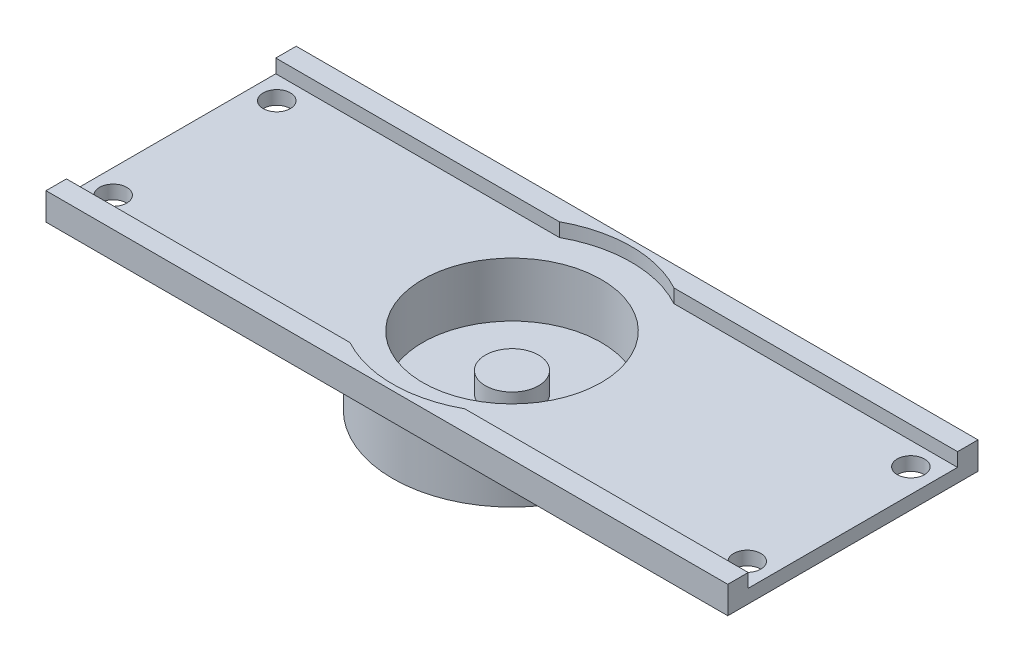
ISO-10303-21;
HEADER;
FILE_DESCRIPTION(('STEP AP214'),'2;1');
FILE_NAME('part.step','',(''),(''),'','','');
FILE_SCHEMA(('AUTOMOTIVE_DESIGN { 1 0 10303 214 1 1 1 1 }'));
ENDSEC;
DATA;
#1=APPLICATION_CONTEXT('core data for automotive mechanical design processes');
#2=APPLICATION_PROTOCOL_DEFINITION('international standard','automotive_design',2000,#1);
#3=PRODUCT_CONTEXT('',#1,'mechanical');
#4=PRODUCT('Part','Part','',(#3));
#5=PRODUCT_RELATED_PRODUCT_CATEGORY('part','',(#4));
#6=PRODUCT_DEFINITION_FORMATION('','',#4);
#7=PRODUCT_DEFINITION_CONTEXT('part definition',#1,'design');
#8=PRODUCT_DEFINITION('design','',#6,#7);
#9=PRODUCT_DEFINITION_SHAPE('','',#8);
#10=(LENGTH_UNIT() NAMED_UNIT(*) SI_UNIT(.MILLI.,.METRE.));
#11=(NAMED_UNIT(*) PLANE_ANGLE_UNIT() SI_UNIT($,.RADIAN.));
#12=(NAMED_UNIT(*) SI_UNIT($,.STERADIAN.) SOLID_ANGLE_UNIT());
#13=UNCERTAINTY_MEASURE_WITH_UNIT(LENGTH_MEASURE(1.E-05),#10,'distance_accuracy_value','');
#14=(GEOMETRIC_REPRESENTATION_CONTEXT(3) GLOBAL_UNCERTAINTY_ASSIGNED_CONTEXT((#13)) GLOBAL_UNIT_ASSIGNED_CONTEXT((#10,
#11,#12)) REPRESENTATION_CONTEXT('',''));
#15=CARTESIAN_POINT('',(0.,0.,0.));
#16=DIRECTION('',(0.,0.,1.));
#17=DIRECTION('',(1.,0.,0.));
#18=AXIS2_PLACEMENT_3D('',#15,#16,#17);
#19=CARTESIAN_POINT('',(0.,-36.,-36.7));
#20=DIRECTION('',(0.,-1.,0.));
#21=DIRECTION('',(0.,0.,-1.));
#22=AXIS2_PLACEMENT_3D('',#19,#20,#21);
#23=PLANE('',#22);
#24=CARTESIAN_POINT('',(46.5,-36.,-48.7));
#25=DIRECTION('',(0.,1.,0.));
#26=DIRECTION('',(0.,0.,1.));
#27=AXIS2_PLACEMENT_3D('',#24,#25,#26);
#28=CIRCLE('',#27,2.);
#29=CARTESIAN_POINT('',(46.5,-36.,-46.7));
#30=VERTEX_POINT('',#29);
#31=EDGE_CURVE('E490',#30,#30,#28,.T.);
#32=ORIENTED_EDGE('',*,*,#31,.T.);
#33=EDGE_LOOP('',(#32));
#34=FACE_BOUND('',#33,.T.);
#35=CARTESIAN_POINT('',(-46.5,-36.,-24.7));
#36=DIRECTION('',(0.,1.,0.));
#37=DIRECTION('',(0.,0.,1.));
#38=AXIS2_PLACEMENT_3D('',#35,#36,#37);
#39=CIRCLE('',#38,2.);
#40=CARTESIAN_POINT('',(-46.5,-36.,-22.7));
#41=VERTEX_POINT('',#40);
#42=EDGE_CURVE('E517',#41,#41,#39,.T.);
#43=ORIENTED_EDGE('',*,*,#42,.T.);
#44=EDGE_LOOP('',(#43));
#45=FACE_BOUND('',#44,.T.);
#46=CARTESIAN_POINT('',(-46.5,-36.,-48.7));
#47=DIRECTION('',(0.,1.,0.));
#48=DIRECTION('',(0.,0.,1.));
#49=AXIS2_PLACEMENT_3D('',#46,#47,#48);
#50=CIRCLE('',#49,2.);
#51=CARTESIAN_POINT('',(-46.5,-36.,-46.7));
#52=VERTEX_POINT('',#51);
#53=EDGE_CURVE('E512',#52,#52,#50,.T.);
#54=ORIENTED_EDGE('',*,*,#53,.T.);
#55=EDGE_LOOP('',(#54));
#56=FACE_BOUND('',#55,.T.);
#57=CARTESIAN_POINT('',(46.5,-36.,-24.7));
#58=DIRECTION('',(0.,1.,0.));
#59=DIRECTION('',(0.,0.,1.));
#60=AXIS2_PLACEMENT_3D('',#57,#58,#59);
#61=CIRCLE('',#60,2.);
#62=CARTESIAN_POINT('',(46.5,-36.,-22.7));
#63=VERTEX_POINT('',#62);
#64=EDGE_CURVE('E489',#63,#63,#61,.T.);
#65=ORIENTED_EDGE('',*,*,#64,.T.);
#66=EDGE_LOOP('',(#65));
#67=FACE_BOUND('',#66,.T.);
#68=DIRECTION('',(0.,0.,1.));
#69=VECTOR('',#68,1.);
#70=CARTESIAN_POINT('',(50.,-36.,-64.05));
#71=LINE('',#70,#69);
#72=CARTESIAN_POINT('',(50.,-36.,-55.05));
#73=VERTEX_POINT('',#72);
#74=CARTESIAN_POINT('',(50.,-36.,-18.35));
#75=VERTEX_POINT('',#74);
#76=EDGE_CURVE('E330',#73,#75,#71,.T.);
#77=ORIENTED_EDGE('',*,*,#76,.T.);
#78=DIRECTION('',(-1.,0.,0.));
#79=VECTOR('',#78,1.);
#80=CARTESIAN_POINT('',(50.,-36.,-18.35));
#81=LINE('',#80,#79);
#82=CARTESIAN_POINT('',(-50.,-36.,-18.35));
#83=VERTEX_POINT('',#82);
#84=EDGE_CURVE('E334',#75,#83,#81,.T.);
#85=ORIENTED_EDGE('',*,*,#84,.T.);
#86=DIRECTION('',(0.,0.,-1.));
#87=VECTOR('',#86,1.);
#88=CARTESIAN_POINT('',(-50.,-36.,-9.35));
#89=LINE('',#88,#87);
#90=CARTESIAN_POINT('',(-50.,-36.,-55.05));
#91=VERTEX_POINT('',#90);
#92=EDGE_CURVE('E343',#83,#91,#89,.T.);
#93=ORIENTED_EDGE('',*,*,#92,.T.);
#94=DIRECTION('',(1.,0.,0.));
#95=VECTOR('',#94,1.);
#96=CARTESIAN_POINT('',(50.,-36.,-55.05));
#97=LINE('',#96,#95);
#98=EDGE_CURVE('E347',#91,#73,#97,.T.);
#99=ORIENTED_EDGE('',*,*,#98,.T.);
#100=EDGE_LOOP('',(#77,#85,#93,#99));
#101=FACE_BOUND('',#100,.T.);
#102=DIRECTION('',(-1.,0.,0.));
#103=VECTOR('',#102,1.);
#104=CARTESIAN_POINT('',(0.,-36.,-31.7));
#105=LINE('',#104,#103);
#106=CARTESIAN_POINT('',(39.,-36.,-31.7));
#107=VERTEX_POINT('',#106);
#108=CARTESIAN_POINT('',(16.7705098312484,-36.,-31.7));
#109=VERTEX_POINT('',#108);
#110=EDGE_CURVE('E461',#107,#109,#105,.T.);
#111=ORIENTED_EDGE('',*,*,#110,.F.);
#112=DIRECTION('',(0.,0.,1.));
#113=VECTOR('',#112,1.);
#114=CARTESIAN_POINT('',(39.,-36.,-36.7));
#115=LINE('',#114,#113);
#116=CARTESIAN_POINT('',(39.,-36.,-41.7));
#117=VERTEX_POINT('',#116);
#118=EDGE_CURVE('E411',#107,#117,#115,.F.);
#119=ORIENTED_EDGE('',*,*,#118,.T.);
#120=DIRECTION('',(-1.,0.,0.));
#121=VECTOR('',#120,1.);
#122=CARTESIAN_POINT('',(0.,-36.,-41.7));
#123=LINE('',#122,#121);
#124=CARTESIAN_POINT('',(16.7705098312484,-36.,-41.7));
#125=VERTEX_POINT('',#124);
#126=EDGE_CURVE('E457',#117,#125,#123,.T.);
#127=ORIENTED_EDGE('',*,*,#126,.T.);
#128=CARTESIAN_POINT('',(0.,-36.,-36.7));
#129=DIRECTION('',(0.,1.,0.));
#130=DIRECTION('',(1.,0.,0.));
#131=AXIS2_PLACEMENT_3D('',#128,#129,#130);
#132=CIRCLE('',#131,17.5);
#133=CARTESIAN_POINT('',(-16.7705098312484,-36.,-41.7));
#134=VERTEX_POINT('',#133);
#135=EDGE_CURVE('E263',#125,#134,#132,.T.);
#136=ORIENTED_EDGE('',*,*,#135,.T.);
#137=DIRECTION('',(-1.,0.,0.));
#138=VECTOR('',#137,1.);
#139=CARTESIAN_POINT('',(0.,-36.,-41.7));
#140=LINE('',#139,#138);
#141=CARTESIAN_POINT('',(-39.,-36.,-41.7));
#142=VERTEX_POINT('',#141);
#143=EDGE_CURVE('E468',#134,#142,#140,.T.);
#144=ORIENTED_EDGE('',*,*,#143,.T.);
#145=DIRECTION('',(0.,0.,1.));
#146=VECTOR('',#145,1.);
#147=CARTESIAN_POINT('',(-39.,-36.,-31.7));
#148=LINE('',#147,#146);
#149=CARTESIAN_POINT('',(-39.,-36.,-31.7));
#150=VERTEX_POINT('',#149);
#151=EDGE_CURVE('E396',#142,#150,#148,.T.);
#152=ORIENTED_EDGE('',*,*,#151,.T.);
#153=DIRECTION('',(-1.,0.,0.));
#154=VECTOR('',#153,1.);
#155=CARTESIAN_POINT('',(0.,-36.,-31.7));
#156=LINE('',#155,#154);
#157=CARTESIAN_POINT('',(-16.7705098312484,-36.,-31.7));
#158=VERTEX_POINT('',#157);
#159=EDGE_CURVE('E250',#158,#150,#156,.T.);
#160=ORIENTED_EDGE('',*,*,#159,.F.);
#161=EDGE_CURVE('E248',#158,#109,#132,.T.);
#162=ORIENTED_EDGE('',*,*,#161,.T.);
#163=EDGE_LOOP('',(#111,#119,#127,#136,#144,#152,#160,#162));
#164=FACE_BOUND('',#163,.T.);
#165=ADVANCED_FACE('F55',(#34,#45,#56,#67,#101,#164),#23,.T.);
#166=CARTESIAN_POINT('',(0.,-34.,-36.7));
#167=DIRECTION('',(0.,-1.,0.));
#168=DIRECTION('',(1.,0.,0.));
#169=AXIS2_PLACEMENT_3D('',#166,#167,#168);
#170=CYLINDRICAL_SURFACE('',#169,17.5);
#171=ORIENTED_EDGE('',*,*,#161,.F.);
#172=DIRECTION('',(0.,-1.,0.));
#173=VECTOR('',#172,1.);
#174=CARTESIAN_POINT('',(-16.7705098312484,-15.2078305169323,-31.7));
#175=LINE('',#174,#173);
#176=CARTESIAN_POINT('',(-16.7705098312484,-44.,-31.7));
#177=VERTEX_POINT('',#176);
#178=EDGE_CURVE('E232',#158,#177,#175,.T.);
#179=ORIENTED_EDGE('',*,*,#178,.T.);
#180=CARTESIAN_POINT('',(0.,-44.,-36.7));
#181=DIRECTION('',(0.,-1.,0.));
#182=DIRECTION('',(1.,0.,0.));
#183=AXIS2_PLACEMENT_3D('',#180,#181,#182);
#184=CIRCLE('',#183,17.5);
#185=CARTESIAN_POINT('',(16.7705098312484,-44.,-31.7));
#186=VERTEX_POINT('',#185);
#187=EDGE_CURVE('E245',#186,#177,#184,.T.);
#188=ORIENTED_EDGE('',*,*,#187,.F.);
#189=DIRECTION('',(0.,-1.,0.));
#190=VECTOR('',#189,1.);
#191=CARTESIAN_POINT('',(16.7705098312484,-15.2078305169323,-31.7));
#192=LINE('',#191,#190);
#193=EDGE_CURVE('E477',#109,#186,#192,.T.);
#194=ORIENTED_EDGE('',*,*,#193,.F.);
#195=EDGE_LOOP('',(#171,#179,#188,#194));
#196=FACE_BOUND('',#195,.T.);
#197=ADVANCED_FACE('F244',(#196),#170,.T.);
#198=DIRECTION('',(0.,-1.,0.));
#199=VECTOR('',#198,1.);
#200=CARTESIAN_POINT('',(-16.7705098312484,-15.2078305169323,-41.7));
#201=LINE('',#200,#199);
#202=CARTESIAN_POINT('',(-16.7705098312484,-44.,-41.7));
#203=VERTEX_POINT('',#202);
#204=EDGE_CURVE('E239',#134,#203,#201,.T.);
#205=ORIENTED_EDGE('',*,*,#204,.F.);
#206=ORIENTED_EDGE('',*,*,#135,.F.);
#207=DIRECTION('',(0.,-1.,0.));
#208=VECTOR('',#207,1.);
#209=CARTESIAN_POINT('',(16.7705098312484,-15.2078305169323,-41.7));
#210=LINE('',#209,#208);
#211=CARTESIAN_POINT('',(16.7705098312484,-44.,-41.7));
#212=VERTEX_POINT('',#211);
#213=EDGE_CURVE('E478',#125,#212,#210,.T.);
#214=ORIENTED_EDGE('',*,*,#213,.T.);
#215=EDGE_CURVE('E258',#203,#212,#184,.T.);
#216=ORIENTED_EDGE('',*,*,#215,.F.);
#217=EDGE_LOOP('',(#205,#206,#214,#216));
#218=FACE_BOUND('',#217,.T.);
#219=ADVANCED_FACE('F570',(#218),#170,.T.);
#220=CARTESIAN_POINT('',(0.,-32.,-19.85));
#221=DIRECTION('',(0.,-1.,0.));
#222=DIRECTION('',(0.,0.,-1.));
#223=AXIS2_PLACEMENT_3D('',#220,#221,#222);
#224=PLANE('',#223);
#225=DIRECTION('',(-1.,0.,0.));
#226=VECTOR('',#225,1.);
#227=CARTESIAN_POINT('',(25.,-32.,-21.35));
#228=LINE('',#227,#226);
#229=CARTESIAN_POINT('',(50.,-32.,-21.35));
#230=VERTEX_POINT('',#229);
#231=CARTESIAN_POINT('',(8.40401689669887,-32.,-21.35));
#232=VERTEX_POINT('',#231);
#233=EDGE_CURVE('E393',#230,#232,#228,.T.);
#234=ORIENTED_EDGE('',*,*,#233,.T.);
#235=CARTESIAN_POINT('',(0.,-32.,-36.7));
#236=DIRECTION('',(0.,-1.,0.));
#237=DIRECTION('',(1.,0.,0.));
#238=AXIS2_PLACEMENT_3D('',#235,#236,#237);
#239=CIRCLE('',#238,17.5);
#240=CARTESIAN_POINT('',(-8.40401689669886,-32.,-21.35));
#241=VERTEX_POINT('',#240);
#242=EDGE_CURVE('E296',#232,#241,#239,.T.);
#243=ORIENTED_EDGE('',*,*,#242,.T.);
#244=DIRECTION('',(-1.,0.,0.));
#245=VECTOR('',#244,1.);
#246=CARTESIAN_POINT('',(-50.,-32.,-21.35));
#247=LINE('',#246,#245);
#248=CARTESIAN_POINT('',(-50.,-32.,-21.35));
#249=VERTEX_POINT('',#248);
#250=EDGE_CURVE('E390',#241,#249,#247,.T.);
#251=ORIENTED_EDGE('',*,*,#250,.T.);
#252=DIRECTION('',(0.,0.,1.));
#253=VECTOR('',#252,1.);
#254=CARTESIAN_POINT('',(-50.,-32.,-9.35));
#255=LINE('',#254,#253);
#256=CARTESIAN_POINT('',(-50.,-32.,-18.35));
#257=VERTEX_POINT('',#256);
#258=EDGE_CURVE('E355',#249,#257,#255,.T.);
#259=ORIENTED_EDGE('',*,*,#258,.T.);
#260=DIRECTION('',(1.,0.,0.));
#261=VECTOR('',#260,1.);
#262=CARTESIAN_POINT('',(50.,-32.,-18.35));
#263=LINE('',#262,#261);
#264=CARTESIAN_POINT('',(50.,-32.,-18.35));
#265=VERTEX_POINT('',#264);
#266=EDGE_CURVE('E338',#257,#265,#263,.T.);
#267=ORIENTED_EDGE('',*,*,#266,.T.);
#268=DIRECTION('',(0.,0.,-1.));
#269=VECTOR('',#268,1.);
#270=CARTESIAN_POINT('',(50.,-32.,-21.35));
#271=LINE('',#270,#269);
#272=EDGE_CURVE('E339',#265,#230,#271,.T.);
#273=ORIENTED_EDGE('',*,*,#272,.T.);
#274=EDGE_LOOP('',(#234,#243,#251,#259,#267,#273));
#275=FACE_BOUND('',#274,.T.);
#276=ADVANCED_FACE('F603',(#275),#224,.F.);
#277=CARTESIAN_POINT('',(50.,-34.,-21.35));
#278=DIRECTION('',(0.,0.,-1.));
#279=DIRECTION('',(-1.,0.,0.));
#280=AXIS2_PLACEMENT_3D('',#277,#278,#279);
#281=PLANE('',#280);
#282=DIRECTION('',(1.,0.,0.));
#283=VECTOR('',#282,1.);
#284=CARTESIAN_POINT('',(25.,-34.,-21.35));
#285=LINE('',#284,#283);
#286=CARTESIAN_POINT('',(8.40401689669887,-34.,-21.35));
#287=VERTEX_POINT('',#286);
#288=CARTESIAN_POINT('',(50.,-34.,-21.35));
#289=VERTEX_POINT('',#288);
#290=EDGE_CURVE('E311',#287,#289,#285,.T.);
#291=ORIENTED_EDGE('',*,*,#290,.F.);
#292=DIRECTION('',(0.,1.,0.));
#293=VECTOR('',#292,1.);
#294=CARTESIAN_POINT('',(8.40401689669887,-34.,-21.35));
#295=LINE('',#294,#293);
#296=EDGE_CURVE('E284',#287,#232,#295,.T.);
#297=ORIENTED_EDGE('',*,*,#296,.T.);
#298=ORIENTED_EDGE('',*,*,#233,.F.);
#299=DIRECTION('',(0.,1.,0.));
#300=VECTOR('',#299,1.);
#301=CARTESIAN_POINT('',(50.,-34.,-21.35));
#302=LINE('',#301,#300);
#303=EDGE_CURVE('E273',#289,#230,#302,.T.);
#304=ORIENTED_EDGE('',*,*,#303,.F.);
#305=EDGE_LOOP('',(#291,#297,#298,#304));
#306=FACE_BOUND('',#305,.T.);
#307=ADVANCED_FACE('F599',(#306),#281,.T.);
#308=CARTESIAN_POINT('',(-8.40401689669886,-34.,-21.35));
#309=DIRECTION('',(0.,0.,-1.));
#310=DIRECTION('',(-1.,0.,0.));
#311=AXIS2_PLACEMENT_3D('',#308,#309,#310);
#312=PLANE('',#311);
#313=DIRECTION('',(1.,0.,0.));
#314=VECTOR('',#313,1.);
#315=CARTESIAN_POINT('',(-50.,-34.,-21.35));
#316=LINE('',#315,#314);
#317=CARTESIAN_POINT('',(-50.,-34.,-21.35));
#318=VERTEX_POINT('',#317);
#319=CARTESIAN_POINT('',(-8.40401689669886,-34.,-21.35));
#320=VERTEX_POINT('',#319);
#321=EDGE_CURVE('E308',#318,#320,#316,.T.);
#322=ORIENTED_EDGE('',*,*,#321,.F.);
#323=DIRECTION('',(0.,1.,0.));
#324=VECTOR('',#323,1.);
#325=CARTESIAN_POINT('',(-50.,-34.,-21.35));
#326=LINE('',#325,#324);
#327=EDGE_CURVE('E358',#318,#249,#326,.T.);
#328=ORIENTED_EDGE('',*,*,#327,.T.);
#329=ORIENTED_EDGE('',*,*,#250,.F.);
#330=DIRECTION('',(0.,1.,0.));
#331=VECTOR('',#330,1.);
#332=CARTESIAN_POINT('',(-8.40401689669886,-34.,-21.35));
#333=LINE('',#332,#331);
#334=EDGE_CURVE('E292',#320,#241,#333,.T.);
#335=ORIENTED_EDGE('',*,*,#334,.F.);
#336=EDGE_LOOP('',(#322,#328,#329,#335));
#337=FACE_BOUND('',#336,.T.);
#338=ADVANCED_FACE('F595',(#337),#312,.T.);
#339=CARTESIAN_POINT('',(-50.,-34.,-21.35));
#340=DIRECTION('',(-1.,0.,0.));
#341=DIRECTION('',(0.,1.,0.));
#342=AXIS2_PLACEMENT_3D('',#339,#340,#341);
#343=PLANE('',#342);
#344=DIRECTION('',(0.,-1.,0.));
#345=VECTOR('',#344,1.);
#346=CARTESIAN_POINT('',(-50.,-34.,-18.35));
#347=LINE('',#346,#345);
#348=EDGE_CURVE('E359',#257,#83,#347,.T.);
#349=ORIENTED_EDGE('',*,*,#348,.F.);
#350=ORIENTED_EDGE('',*,*,#258,.F.);
#351=ORIENTED_EDGE('',*,*,#327,.F.);
#352=DIRECTION('',(0.,0.,-1.));
#353=VECTOR('',#352,1.);
#354=CARTESIAN_POINT('',(-50.,-34.,-9.35));
#355=LINE('',#354,#353);
#356=CARTESIAN_POINT('',(-50.,-34.,-52.05));
#357=VERTEX_POINT('',#356);
#358=EDGE_CURVE('E329',#318,#357,#355,.T.);
#359=ORIENTED_EDGE('',*,*,#358,.T.);
#360=DIRECTION('',(0.,1.,0.));
#361=VECTOR('',#360,1.);
#362=CARTESIAN_POINT('',(-50.,-34.,-52.05));
#363=LINE('',#362,#361);
#364=CARTESIAN_POINT('',(-50.,-32.,-52.05));
#365=VERTEX_POINT('',#364);
#366=EDGE_CURVE('E314',#357,#365,#363,.T.);
#367=ORIENTED_EDGE('',*,*,#366,.T.);
#368=DIRECTION('',(0.,0.,1.));
#369=VECTOR('',#368,1.);
#370=CARTESIAN_POINT('',(-50.,-32.,-52.05));
#371=LINE('',#370,#369);
#372=CARTESIAN_POINT('',(-50.,-32.,-55.05));
#373=VERTEX_POINT('',#372);
#374=EDGE_CURVE('E271',#373,#365,#371,.T.);
#375=ORIENTED_EDGE('',*,*,#374,.F.);
#376=DIRECTION('',(0.,-1.,0.));
#377=VECTOR('',#376,1.);
#378=CARTESIAN_POINT('',(-50.,-34.,-55.05));
#379=LINE('',#378,#377);
#380=EDGE_CURVE('E351',#373,#91,#379,.T.);
#381=ORIENTED_EDGE('',*,*,#380,.T.);
#382=ORIENTED_EDGE('',*,*,#92,.F.);
#383=EDGE_LOOP('',(#349,#350,#351,#359,#367,#375,#381,#382));
#384=FACE_BOUND('',#383,.T.);
#385=ADVANCED_FACE('F592',(#384),#343,.T.);
#386=CARTESIAN_POINT('',(-50.,-34.,-18.35));
#387=DIRECTION('',(0.,0.,1.));
#388=DIRECTION('',(0.,-1.,0.));
#389=AXIS2_PLACEMENT_3D('',#386,#387,#388);
#390=PLANE('',#389);
#391=DIRECTION('',(0.,-1.,0.));
#392=VECTOR('',#391,1.);
#393=CARTESIAN_POINT('',(50.,-34.,-18.35));
#394=LINE('',#393,#392);
#395=EDGE_CURVE('E335',#265,#75,#394,.T.);
#396=ORIENTED_EDGE('',*,*,#395,.F.);
#397=ORIENTED_EDGE('',*,*,#266,.F.);
#398=ORIENTED_EDGE('',*,*,#348,.T.);
#399=ORIENTED_EDGE('',*,*,#84,.F.);
#400=EDGE_LOOP('',(#396,#397,#398,#399));
#401=FACE_BOUND('',#400,.T.);
#402=ADVANCED_FACE('F590',(#401),#390,.T.);
#403=CARTESIAN_POINT('',(50.,-34.,-18.35));
#404=DIRECTION('',(1.,0.,0.));
#405=DIRECTION('',(0.,1.,0.));
#406=AXIS2_PLACEMENT_3D('',#403,#404,#405);
#407=PLANE('',#406);
#408=ORIENTED_EDGE('',*,*,#303,.T.);
#409=ORIENTED_EDGE('',*,*,#272,.F.);
#410=ORIENTED_EDGE('',*,*,#395,.T.);
#411=ORIENTED_EDGE('',*,*,#76,.F.);
#412=DIRECTION('',(0.,-1.,0.));
#413=VECTOR('',#412,1.);
#414=CARTESIAN_POINT('',(50.,-34.,-55.05));
#415=LINE('',#414,#413);
#416=CARTESIAN_POINT('',(50.,-32.,-55.05));
#417=VERTEX_POINT('',#416);
#418=EDGE_CURVE('E363',#417,#73,#415,.T.);
#419=ORIENTED_EDGE('',*,*,#418,.F.);
#420=DIRECTION('',(0.,0.,-1.));
#421=VECTOR('',#420,1.);
#422=CARTESIAN_POINT('',(50.,-32.,-64.05));
#423=LINE('',#422,#421);
#424=CARTESIAN_POINT('',(50.,-32.,-52.05));
#425=VERTEX_POINT('',#424);
#426=EDGE_CURVE('E274',#425,#417,#423,.T.);
#427=ORIENTED_EDGE('',*,*,#426,.F.);
#428=DIRECTION('',(0.,1.,0.));
#429=VECTOR('',#428,1.);
#430=CARTESIAN_POINT('',(50.,-34.,-52.05));
#431=LINE('',#430,#429);
#432=CARTESIAN_POINT('',(50.,-34.,-52.05));
#433=VERTEX_POINT('',#432);
#434=EDGE_CURVE('E366',#433,#425,#431,.T.);
#435=ORIENTED_EDGE('',*,*,#434,.F.);
#436=DIRECTION('',(0.,0.,1.));
#437=VECTOR('',#436,1.);
#438=CARTESIAN_POINT('',(50.,-34.,-64.05));
#439=LINE('',#438,#437);
#440=EDGE_CURVE('E318',#433,#289,#439,.T.);
#441=ORIENTED_EDGE('',*,*,#440,.T.);
#442=EDGE_LOOP('',(#408,#409,#410,#411,#419,#427,#435,#441));
#443=FACE_BOUND('',#442,.T.);
#444=ADVANCED_FACE('F587',(#443),#407,.T.);
#445=CARTESIAN_POINT('',(0.,-32.,-53.55));
#446=DIRECTION('',(0.,-1.,0.));
#447=DIRECTION('',(0.,0.,-1.));
#448=AXIS2_PLACEMENT_3D('',#445,#446,#447);
#449=PLANE('',#448);
#450=DIRECTION('',(1.,0.,0.));
#451=VECTOR('',#450,1.);
#452=CARTESIAN_POINT('',(-25.,-32.,-52.05));
#453=LINE('',#452,#451);
#454=CARTESIAN_POINT('',(-8.40401689669886,-32.,-52.05));
#455=VERTEX_POINT('',#454);
#456=EDGE_CURVE('E374',#365,#455,#453,.T.);
#457=ORIENTED_EDGE('',*,*,#456,.T.);
#458=CARTESIAN_POINT('',(0.,-32.,-36.7));
#459=DIRECTION('',(0.,-1.,0.));
#460=DIRECTION('',(1.,0.,0.));
#461=AXIS2_PLACEMENT_3D('',#458,#459,#460);
#462=CIRCLE('',#461,17.5);
#463=CARTESIAN_POINT('',(8.40401689669886,-32.,-52.05));
#464=VERTEX_POINT('',#463);
#465=EDGE_CURVE('E303',#455,#464,#462,.T.);
#466=ORIENTED_EDGE('',*,*,#465,.T.);
#467=DIRECTION('',(1.,0.,0.));
#468=VECTOR('',#467,1.);
#469=CARTESIAN_POINT('',(50.,-32.,-52.05));
#470=LINE('',#469,#468);
#471=EDGE_CURVE('E370',#464,#425,#470,.T.);
#472=ORIENTED_EDGE('',*,*,#471,.T.);
#473=ORIENTED_EDGE('',*,*,#426,.T.);
#474=DIRECTION('',(-1.,0.,0.));
#475=VECTOR('',#474,1.);
#476=CARTESIAN_POINT('',(50.,-32.,-55.05));
#477=LINE('',#476,#475);
#478=EDGE_CURVE('E354',#417,#373,#477,.T.);
#479=ORIENTED_EDGE('',*,*,#478,.T.);
#480=ORIENTED_EDGE('',*,*,#374,.T.);
#481=EDGE_LOOP('',(#457,#466,#472,#473,#479,#480));
#482=FACE_BOUND('',#481,.T.);
#483=ADVANCED_FACE('F585',(#482),#449,.F.);
#484=CARTESIAN_POINT('',(-50.,-34.,-52.05));
#485=DIRECTION('',(0.,0.,1.));
#486=DIRECTION('',(0.,-1.,0.));
#487=AXIS2_PLACEMENT_3D('',#484,#485,#486);
#488=PLANE('',#487);
#489=DIRECTION('',(-1.,0.,0.));
#490=VECTOR('',#489,1.);
#491=CARTESIAN_POINT('',(-25.,-34.,-52.05));
#492=LINE('',#491,#490);
#493=CARTESIAN_POINT('',(-8.40401689669886,-34.,-52.05));
#494=VERTEX_POINT('',#493);
#495=EDGE_CURVE('E325',#494,#357,#492,.T.);
#496=ORIENTED_EDGE('',*,*,#495,.F.);
#497=DIRECTION('',(0.,1.,0.));
#498=VECTOR('',#497,1.);
#499=CARTESIAN_POINT('',(-8.40401689669886,-34.,-52.05));
#500=LINE('',#499,#498);
#501=EDGE_CURVE('E307',#494,#455,#500,.T.);
#502=ORIENTED_EDGE('',*,*,#501,.T.);
#503=ORIENTED_EDGE('',*,*,#456,.F.);
#504=ORIENTED_EDGE('',*,*,#366,.F.);
#505=EDGE_LOOP('',(#496,#502,#503,#504));
#506=FACE_BOUND('',#505,.T.);
#507=ADVANCED_FACE('F581',(#506),#488,.T.);
#508=CARTESIAN_POINT('',(8.40401689669886,-34.,-52.05));
#509=DIRECTION('',(0.,0.,1.));
#510=DIRECTION('',(1.,0.,0.));
#511=AXIS2_PLACEMENT_3D('',#508,#509,#510);
#512=PLANE('',#511);
#513=DIRECTION('',(-1.,0.,0.));
#514=VECTOR('',#513,1.);
#515=CARTESIAN_POINT('',(50.,-34.,-52.05));
#516=LINE('',#515,#514);
#517=CARTESIAN_POINT('',(8.40401689669886,-34.,-52.05));
#518=VERTEX_POINT('',#517);
#519=EDGE_CURVE('E322',#433,#518,#516,.T.);
#520=ORIENTED_EDGE('',*,*,#519,.F.);
#521=ORIENTED_EDGE('',*,*,#434,.T.);
#522=ORIENTED_EDGE('',*,*,#471,.F.);
#523=DIRECTION('',(0.,1.,0.));
#524=VECTOR('',#523,1.);
#525=CARTESIAN_POINT('',(8.40401689669886,-34.,-52.05));
#526=LINE('',#525,#524);
#527=EDGE_CURVE('E283',#518,#464,#526,.T.);
#528=ORIENTED_EDGE('',*,*,#527,.F.);
#529=EDGE_LOOP('',(#520,#521,#522,#528));
#530=FACE_BOUND('',#529,.T.);
#531=ADVANCED_FACE('F577',(#530),#512,.T.);
#532=CARTESIAN_POINT('',(50.,-34.,-55.05));
#533=DIRECTION('',(0.,0.,-1.));
#534=DIRECTION('',(-1.,0.,0.));
#535=AXIS2_PLACEMENT_3D('',#532,#533,#534);
#536=PLANE('',#535);
#537=ORIENTED_EDGE('',*,*,#380,.F.);
#538=ORIENTED_EDGE('',*,*,#478,.F.);
#539=ORIENTED_EDGE('',*,*,#418,.T.);
#540=ORIENTED_EDGE('',*,*,#98,.F.);
#541=EDGE_LOOP('',(#537,#538,#539,#540));
#542=FACE_BOUND('',#541,.T.);
#543=ADVANCED_FACE('F580',(#542),#536,.T.);
#544=CARTESIAN_POINT('',(0.,-34.,-36.7));
#545=DIRECTION('',(0.,-1.,0.));
#546=DIRECTION('',(0.,0.,-1.));
#547=AXIS2_PLACEMENT_3D('',#544,#545,#546);
#548=PLANE('',#547);
#549=CARTESIAN_POINT('',(0.,-34.,-36.7));
#550=DIRECTION('',(0.,1.,0.));
#551=DIRECTION('',(1.,0.,0.));
#552=AXIS2_PLACEMENT_3D('',#549,#550,#551);
#553=CIRCLE('',#552,13.1);
#554=CARTESIAN_POINT('',(13.1,-34.,-36.7));
#555=VERTEX_POINT('',#554);
#556=EDGE_CURVE('E278',#555,#555,#553,.T.);
#557=ORIENTED_EDGE('',*,*,#556,.F.);
#558=EDGE_LOOP('',(#557));
#559=FACE_BOUND('',#558,.T.);
#560=CARTESIAN_POINT('',(46.5,-34.,-48.7));
#561=DIRECTION('',(0.,-1.,0.));
#562=DIRECTION('',(0.,0.,1.));
#563=AXIS2_PLACEMENT_3D('',#560,#561,#562);
#564=CIRCLE('',#563,2.);
#565=CARTESIAN_POINT('',(46.5,-34.,-46.7));
#566=VERTEX_POINT('',#565);
#567=EDGE_CURVE('E495',#566,#566,#564,.T.);
#568=ORIENTED_EDGE('',*,*,#567,.T.);
#569=EDGE_LOOP('',(#568));
#570=FACE_BOUND('',#569,.T.);
#571=CARTESIAN_POINT('',(-46.5,-34.,-24.7));
#572=DIRECTION('',(0.,-1.,0.));
#573=DIRECTION('',(0.,0.,1.));
#574=AXIS2_PLACEMENT_3D('',#571,#572,#573);
#575=CIRCLE('',#574,2.);
#576=CARTESIAN_POINT('',(-46.5,-34.,-22.7));
#577=VERTEX_POINT('',#576);
#578=EDGE_CURVE('E513',#577,#577,#575,.T.);
#579=ORIENTED_EDGE('',*,*,#578,.T.);
#580=EDGE_LOOP('',(#579));
#581=FACE_BOUND('',#580,.T.);
#582=CARTESIAN_POINT('',(-46.5,-34.,-48.7));
#583=DIRECTION('',(0.,-1.,0.));
#584=DIRECTION('',(0.,0.,1.));
#585=AXIS2_PLACEMENT_3D('',#582,#583,#584);
#586=CIRCLE('',#585,2.);
#587=CARTESIAN_POINT('',(-46.5,-34.,-46.7));
#588=VERTEX_POINT('',#587);
#589=EDGE_CURVE('E502',#588,#588,#586,.T.);
#590=ORIENTED_EDGE('',*,*,#589,.T.);
#591=EDGE_LOOP('',(#590));
#592=FACE_BOUND('',#591,.T.);
#593=CARTESIAN_POINT('',(46.5,-34.,-24.7));
#594=DIRECTION('',(0.,-1.,0.));
#595=DIRECTION('',(0.,0.,1.));
#596=AXIS2_PLACEMENT_3D('',#593,#594,#595);
#597=CIRCLE('',#596,2.);
#598=CARTESIAN_POINT('',(46.5,-34.,-22.7));
#599=VERTEX_POINT('',#598);
#600=EDGE_CURVE('E470',#599,#599,#597,.T.);
#601=ORIENTED_EDGE('',*,*,#600,.T.);
#602=EDGE_LOOP('',(#601));
#603=FACE_BOUND('',#602,.T.);
#604=ORIENTED_EDGE('',*,*,#321,.T.);
#605=CARTESIAN_POINT('',(0.,-34.,-36.7));
#606=DIRECTION('',(0.,-1.,0.));
#607=DIRECTION('',(1.,0.,0.));
#608=AXIS2_PLACEMENT_3D('',#605,#606,#607);
#609=CIRCLE('',#608,17.5);
#610=EDGE_CURVE('E288',#287,#320,#609,.T.);
#611=ORIENTED_EDGE('',*,*,#610,.F.);
#612=ORIENTED_EDGE('',*,*,#290,.T.);
#613=ORIENTED_EDGE('',*,*,#440,.F.);
#614=ORIENTED_EDGE('',*,*,#519,.T.);
#615=CARTESIAN_POINT('',(0.,-34.,-36.7));
#616=DIRECTION('',(0.,-1.,0.));
#617=DIRECTION('',(1.,0.,0.));
#618=AXIS2_PLACEMENT_3D('',#615,#616,#617);
#619=CIRCLE('',#618,17.5);
#620=EDGE_CURVE('E279',#494,#518,#619,.T.);
#621=ORIENTED_EDGE('',*,*,#620,.F.);
#622=ORIENTED_EDGE('',*,*,#495,.T.);
#623=ORIENTED_EDGE('',*,*,#358,.F.);
#624=EDGE_LOOP('',(#604,#611,#612,#613,#614,#621,#622,#623));
#625=FACE_BOUND('',#624,.T.);
#626=ADVANCED_FACE('F738',(#559,#570,#581,#592,#603,#625),#548,.F.);
#627=CARTESIAN_POINT('',(0.,-34.,-36.7));
#628=DIRECTION('',(0.,1.,0.));
#629=DIRECTION('',(1.,0.,0.));
#630=AXIS2_PLACEMENT_3D('',#627,#628,#629);
#631=CYLINDRICAL_SURFACE('',#630,17.5);
#632=ORIENTED_EDGE('',*,*,#620,.T.);
#633=ORIENTED_EDGE('',*,*,#527,.T.);
#634=ORIENTED_EDGE('',*,*,#465,.F.);
#635=ORIENTED_EDGE('',*,*,#501,.F.);
#636=EDGE_LOOP('',(#632,#633,#634,#635));
#637=FACE_BOUND('',#636,.T.);
#638=ADVANCED_FACE('F575',(#637),#631,.F.);
#639=CARTESIAN_POINT('',(0.,-34.,-36.7));
#640=DIRECTION('',(0.,1.,0.));
#641=DIRECTION('',(1.,0.,0.));
#642=AXIS2_PLACEMENT_3D('',#639,#640,#641);
#643=CYLINDRICAL_SURFACE('',#642,17.5);
#644=ORIENTED_EDGE('',*,*,#610,.T.);
#645=ORIENTED_EDGE('',*,*,#334,.T.);
#646=ORIENTED_EDGE('',*,*,#242,.F.);
#647=ORIENTED_EDGE('',*,*,#296,.F.);
#648=EDGE_LOOP('',(#644,#645,#646,#647));
#649=FACE_BOUND('',#648,.T.);
#650=ADVANCED_FACE('F675',(#649),#643,.F.);
#651=CARTESIAN_POINT('',(0.,-44.,-36.7));
#652=DIRECTION('',(0.,-1.,0.));
#653=DIRECTION('',(0.,0.,-1.));
#654=AXIS2_PLACEMENT_3D('',#651,#652,#653);
#655=PLANE('',#654);
#656=DIRECTION('',(1.,0.,0.));
#657=VECTOR('',#656,1.);
#658=CARTESIAN_POINT('',(0.,-44.,-41.7));
#659=LINE('',#658,#657);
#660=CARTESIAN_POINT('',(31.,-44.,-41.7));
#661=VERTEX_POINT('',#660);
#662=EDGE_CURVE('E474',#212,#661,#659,.T.);
#663=ORIENTED_EDGE('',*,*,#662,.T.);
#664=DIRECTION('',(0.,0.,-1.));
#665=VECTOR('',#664,1.);
#666=CARTESIAN_POINT('',(31.,-44.,-31.7));
#667=LINE('',#666,#665);
#668=CARTESIAN_POINT('',(31.,-44.,-31.7));
#669=VERTEX_POINT('',#668);
#670=EDGE_CURVE('E421',#661,#669,#667,.F.);
#671=ORIENTED_EDGE('',*,*,#670,.T.);
#672=DIRECTION('',(1.,0.,0.));
#673=VECTOR('',#672,1.);
#674=CARTESIAN_POINT('',(0.,-44.,-31.7));
#675=LINE('',#674,#673);
#676=EDGE_CURVE('E256',#186,#669,#675,.T.);
#677=ORIENTED_EDGE('',*,*,#676,.F.);
#678=ORIENTED_EDGE('',*,*,#187,.T.);
#679=DIRECTION('',(1.,0.,0.));
#680=VECTOR('',#679,1.);
#681=CARTESIAN_POINT('',(0.,-44.,-31.7));
#682=LINE('',#681,#680);
#683=CARTESIAN_POINT('',(-31.,-44.,-31.7));
#684=VERTEX_POINT('',#683);
#685=EDGE_CURVE('E229',#684,#177,#682,.T.);
#686=ORIENTED_EDGE('',*,*,#685,.F.);
#687=DIRECTION('',(0.,0.,-1.));
#688=VECTOR('',#687,1.);
#689=CARTESIAN_POINT('',(-31.,-44.,-36.7));
#690=LINE('',#689,#688);
#691=CARTESIAN_POINT('',(-31.,-44.,-41.7));
#692=VERTEX_POINT('',#691);
#693=EDGE_CURVE('E418',#684,#692,#690,.T.);
#694=ORIENTED_EDGE('',*,*,#693,.T.);
#695=DIRECTION('',(1.,0.,0.));
#696=VECTOR('',#695,1.);
#697=CARTESIAN_POINT('',(0.,-44.,-41.7));
#698=LINE('',#697,#696);
#699=EDGE_CURVE('E240',#692,#203,#698,.T.);
#700=ORIENTED_EDGE('',*,*,#699,.T.);
#701=ORIENTED_EDGE('',*,*,#215,.T.);
#702=EDGE_LOOP('',(#663,#671,#677,#678,#686,#694,#700,#701));
#703=FACE_BOUND('',#702,.T.);
#704=ADVANCED_FACE('F254',(#703),#655,.T.);
#705=CARTESIAN_POINT('',(0.,-34.,-36.7));
#706=DIRECTION('',(0.,-1.,0.));
#707=DIRECTION('',(1.,0.,0.));
#708=AXIS2_PLACEMENT_3D('',#705,#706,#707);
#709=CYLINDRICAL_SURFACE('',#708,13.1);
#710=ORIENTED_EDGE('',*,*,#556,.T.);
#711=EDGE_LOOP('',(#710));
#712=FACE_BOUND('',#711,.T.);
#713=CARTESIAN_POINT('',(0.,-42.,-36.7));
#714=DIRECTION('',(0.,-1.,0.));
#715=DIRECTION('',(1.,0.,0.));
#716=AXIS2_PLACEMENT_3D('',#713,#714,#715);
#717=CIRCLE('',#716,13.1);
#718=CARTESIAN_POINT('',(13.1,-42.,-36.7));
#719=VERTEX_POINT('',#718);
#720=EDGE_CURVE('E266',#719,#719,#717,.T.);
#721=ORIENTED_EDGE('',*,*,#720,.T.);
#722=EDGE_LOOP('',(#721));
#723=FACE_BOUND('',#722,.T.);
#724=ADVANCED_FACE('F674',(#712,#723),#709,.F.);
#725=CARTESIAN_POINT('',(0.,-42.,-36.7));
#726=DIRECTION('',(0.,-1.,0.));
#727=DIRECTION('',(0.,0.,-1.));
#728=AXIS2_PLACEMENT_3D('',#725,#726,#727);
#729=PLANE('',#728);
#730=CARTESIAN_POINT('',(0.,-42.,-36.7));
#731=DIRECTION('',(0.,-1.,0.));
#732=DIRECTION('',(-1.,0.,0.));
#733=AXIS2_PLACEMENT_3D('',#730,#731,#732);
#734=CIRCLE('',#733,3.9);
#735=CARTESIAN_POINT('',(-3.9,-42.,-36.7));
#736=VERTEX_POINT('',#735);
#737=EDGE_CURVE('E269',#736,#736,#734,.T.);
#738=ORIENTED_EDGE('',*,*,#737,.T.);
#739=EDGE_LOOP('',(#738));
#740=FACE_BOUND('',#739,.T.);
#741=ORIENTED_EDGE('',*,*,#720,.F.);
#742=EDGE_LOOP('',(#741));
#743=FACE_BOUND('',#742,.T.);
#744=ADVANCED_FACE('F542',(#740,#743),#729,.F.);
#745=CARTESIAN_POINT('',(0.,-39.,-36.7));
#746=DIRECTION('',(0.,-1.,0.));
#747=DIRECTION('',(0.,0.,-1.));
#748=AXIS2_PLACEMENT_3D('',#745,#746,#747);
#749=PLANE('',#748);
#750=CARTESIAN_POINT('',(0.,-39.,-36.7));
#751=DIRECTION('',(0.,1.,0.));
#752=DIRECTION('',(-1.,0.,0.));
#753=AXIS2_PLACEMENT_3D('',#750,#751,#752);
#754=CIRCLE('',#753,3.9);
#755=CARTESIAN_POINT('',(-3.9,-39.,-36.7));
#756=VERTEX_POINT('',#755);
#757=EDGE_CURVE('E494',#756,#756,#754,.T.);
#758=ORIENTED_EDGE('',*,*,#757,.T.);
#759=EDGE_LOOP('',(#758));
#760=FACE_BOUND('',#759,.T.);
#761=ADVANCED_FACE('F549',(#760),#749,.F.);
#762=CARTESIAN_POINT('',(0.,-44.,-36.7));
#763=DIRECTION('',(0.,1.,0.));
#764=DIRECTION('',(-1.,0.,0.));
#765=AXIS2_PLACEMENT_3D('',#762,#763,#764);
#766=CYLINDRICAL_SURFACE('',#765,3.9);
#767=ORIENTED_EDGE('',*,*,#737,.F.);
#768=EDGE_LOOP('',(#767));
#769=FACE_BOUND('',#768,.T.);
#770=ORIENTED_EDGE('',*,*,#757,.F.);
#771=EDGE_LOOP('',(#770));
#772=FACE_BOUND('',#771,.T.);
#773=ADVANCED_FACE('F545',(#769,#772),#766,.T.);
#774=CARTESIAN_POINT('',(46.5,-38.,-48.7));
#775=DIRECTION('',(0.,-1.,0.));
#776=DIRECTION('',(0.,0.,1.));
#777=AXIS2_PLACEMENT_3D('',#774,#775,#776);
#778=CYLINDRICAL_SURFACE('',#777,2.);
#779=ORIENTED_EDGE('',*,*,#31,.F.);
#780=EDGE_LOOP('',(#779));
#781=FACE_BOUND('',#780,.T.);
#782=ORIENTED_EDGE('',*,*,#567,.F.);
#783=EDGE_LOOP('',(#782));
#784=FACE_BOUND('',#783,.T.);
#785=ADVANCED_FACE('F548',(#781,#784),#778,.F.);
#786=CARTESIAN_POINT('',(-46.5,-38.,-24.7));
#787=DIRECTION('',(0.,-1.,0.));
#788=DIRECTION('',(0.,0.,1.));
#789=AXIS2_PLACEMENT_3D('',#786,#787,#788);
#790=CYLINDRICAL_SURFACE('',#789,2.);
#791=ORIENTED_EDGE('',*,*,#42,.F.);
#792=EDGE_LOOP('',(#791));
#793=FACE_BOUND('',#792,.T.);
#794=ORIENTED_EDGE('',*,*,#578,.F.);
#795=EDGE_LOOP('',(#794));
#796=FACE_BOUND('',#795,.T.);
#797=ADVANCED_FACE('F556',(#793,#796),#790,.F.);
#798=CARTESIAN_POINT('',(-46.5,-38.,-48.7));
#799=DIRECTION('',(0.,-1.,0.));
#800=DIRECTION('',(0.,0.,1.));
#801=AXIS2_PLACEMENT_3D('',#798,#799,#800);
#802=CYLINDRICAL_SURFACE('',#801,2.);
#803=ORIENTED_EDGE('',*,*,#53,.F.);
#804=EDGE_LOOP('',(#803));
#805=FACE_BOUND('',#804,.T.);
#806=ORIENTED_EDGE('',*,*,#589,.F.);
#807=EDGE_LOOP('',(#806));
#808=FACE_BOUND('',#807,.T.);
#809=ADVANCED_FACE('F732',(#805,#808),#802,.F.);
#810=CARTESIAN_POINT('',(46.5,-38.,-24.7));
#811=DIRECTION('',(0.,-1.,0.));
#812=DIRECTION('',(0.,0.,1.));
#813=AXIS2_PLACEMENT_3D('',#810,#811,#812);
#814=CYLINDRICAL_SURFACE('',#813,2.);
#815=ORIENTED_EDGE('',*,*,#64,.F.);
#816=EDGE_LOOP('',(#815));
#817=FACE_BOUND('',#816,.T.);
#818=ORIENTED_EDGE('',*,*,#600,.F.);
#819=EDGE_LOOP('',(#818));
#820=FACE_BOUND('',#819,.T.);
#821=ADVANCED_FACE('F666',(#817,#820),#814,.F.);
#822=CARTESIAN_POINT('',(0.,-15.2078305169323,-31.7));
#823=DIRECTION('',(0.,0.,-1.));
#824=DIRECTION('',(0.,1.,0.));
#825=AXIS2_PLACEMENT_3D('',#822,#823,#824);
#826=PLANE('',#825);
#827=CARTESIAN_POINT('',(30.,-40.,-31.7));
#828=DIRECTION('',(0.,0.,-1.));
#829=DIRECTION('',(0.,1.,0.));
#830=AXIS2_PLACEMENT_3D('',#827,#828,#829);
#831=CIRCLE('',#830,2.4);
#832=CARTESIAN_POINT('',(30.,-37.6,-31.7));
#833=VERTEX_POINT('',#832);
#834=EDGE_CURVE('E407',#833,#833,#831,.T.);
#835=ORIENTED_EDGE('',*,*,#834,.T.);
#836=EDGE_LOOP('',(#835));
#837=FACE_BOUND('',#836,.T.);
#838=ORIENTED_EDGE('',*,*,#676,.T.);
#839=CARTESIAN_POINT('',(31.,-40.,-31.7));
#840=DIRECTION('',(0.,0.,-1.));
#841=DIRECTION('',(0.,1.,0.));
#842=AXIS2_PLACEMENT_3D('',#839,#840,#841);
#843=CIRCLE('',#842,4.);
#844=CARTESIAN_POINT('',(35.,-40.,-31.7));
#845=VERTEX_POINT('',#844);
#846=EDGE_CURVE('E424',#669,#845,#843,.F.);
#847=ORIENTED_EDGE('',*,*,#846,.T.);
#848=CARTESIAN_POINT('',(39.,-40.,-31.7));
#849=DIRECTION('',(0.,0.,-1.));
#850=DIRECTION('',(0.,1.,0.));
#851=AXIS2_PLACEMENT_3D('',#848,#849,#850);
#852=CIRCLE('',#851,4.);
#853=EDGE_CURVE('E431',#845,#107,#852,.T.);
#854=ORIENTED_EDGE('',*,*,#853,.T.);
#855=ORIENTED_EDGE('',*,*,#110,.T.);
#856=ORIENTED_EDGE('',*,*,#193,.T.);
#857=EDGE_LOOP('',(#838,#847,#854,#855,#856));
#858=FACE_BOUND('',#857,.T.);
#859=ADVANCED_FACE('F658',(#837,#858),#826,.F.);
#860=CARTESIAN_POINT('',(0.,-15.2078305169323,-41.7));
#861=DIRECTION('',(0.,0.,-1.));
#862=DIRECTION('',(0.,1.,0.));
#863=AXIS2_PLACEMENT_3D('',#860,#861,#862);
#864=PLANE('',#863);
#865=CARTESIAN_POINT('',(30.,-40.,-41.7));
#866=DIRECTION('',(0.,0.,-1.));
#867=DIRECTION('',(0.,1.,0.));
#868=AXIS2_PLACEMENT_3D('',#865,#866,#867);
#869=CIRCLE('',#868,2.4);
#870=CARTESIAN_POINT('',(30.,-37.6,-41.7));
#871=VERTEX_POINT('',#870);
#872=EDGE_CURVE('E403',#871,#871,#869,.T.);
#873=ORIENTED_EDGE('',*,*,#872,.F.);
#874=EDGE_LOOP('',(#873));
#875=FACE_BOUND('',#874,.T.);
#876=ORIENTED_EDGE('',*,*,#126,.F.);
#877=CARTESIAN_POINT('',(39.,-40.,-41.7));
#878=DIRECTION('',(0.,0.,-1.));
#879=DIRECTION('',(0.,1.,0.));
#880=AXIS2_PLACEMENT_3D('',#877,#878,#879);
#881=CIRCLE('',#880,4.);
#882=CARTESIAN_POINT('',(35.,-40.,-41.7));
#883=VERTEX_POINT('',#882);
#884=EDGE_CURVE('E435',#117,#883,#881,.F.);
#885=ORIENTED_EDGE('',*,*,#884,.T.);
#886=CARTESIAN_POINT('',(31.,-40.,-41.7));
#887=DIRECTION('',(0.,0.,-1.));
#888=DIRECTION('',(0.,1.,0.));
#889=AXIS2_PLACEMENT_3D('',#886,#887,#888);
#890=CIRCLE('',#889,4.);
#891=EDGE_CURVE('E415',#883,#661,#890,.T.);
#892=ORIENTED_EDGE('',*,*,#891,.T.);
#893=ORIENTED_EDGE('',*,*,#662,.F.);
#894=ORIENTED_EDGE('',*,*,#213,.F.);
#895=EDGE_LOOP('',(#876,#885,#892,#893,#894));
#896=FACE_BOUND('',#895,.T.);
#897=ADVANCED_FACE('F649',(#875,#896),#864,.T.);
#898=CARTESIAN_POINT('',(0.,-15.2078305169323,-31.7));
#899=DIRECTION('',(0.,0.,-1.));
#900=DIRECTION('',(0.,1.,0.));
#901=AXIS2_PLACEMENT_3D('',#898,#899,#900);
#902=PLANE('',#901);
#903=CARTESIAN_POINT('',(-30.,-40.,-31.7));
#904=DIRECTION('',(0.,0.,-1.));
#905=DIRECTION('',(0.,1.,0.));
#906=AXIS2_PLACEMENT_3D('',#903,#904,#905);
#907=CIRCLE('',#906,2.4);
#908=CARTESIAN_POINT('',(-30.,-37.6,-31.7));
#909=VERTEX_POINT('',#908);
#910=EDGE_CURVE('E401',#909,#909,#907,.T.);
#911=ORIENTED_EDGE('',*,*,#910,.T.);
#912=EDGE_LOOP('',(#911));
#913=FACE_BOUND('',#912,.T.);
#914=ORIENTED_EDGE('',*,*,#159,.T.);
#915=CARTESIAN_POINT('',(-39.,-40.,-31.7));
#916=DIRECTION('',(0.,0.,-1.));
#917=DIRECTION('',(0.,1.,0.));
#918=AXIS2_PLACEMENT_3D('',#915,#916,#917);
#919=CIRCLE('',#918,4.);
#920=CARTESIAN_POINT('',(-35.,-40.,-31.7));
#921=VERTEX_POINT('',#920);
#922=EDGE_CURVE('E65',#150,#921,#919,.T.);
#923=ORIENTED_EDGE('',*,*,#922,.T.);
#924=CARTESIAN_POINT('',(-31.,-40.,-31.7));
#925=DIRECTION('',(0.,0.,-1.));
#926=DIRECTION('',(0.,1.,0.));
#927=AXIS2_PLACEMENT_3D('',#924,#925,#926);
#928=CIRCLE('',#927,4.);
#929=EDGE_CURVE('E234',#921,#684,#928,.F.);
#930=ORIENTED_EDGE('',*,*,#929,.T.);
#931=ORIENTED_EDGE('',*,*,#685,.T.);
#932=ORIENTED_EDGE('',*,*,#178,.F.);
#933=EDGE_LOOP('',(#914,#923,#930,#931,#932));
#934=FACE_BOUND('',#933,.T.);
#935=ADVANCED_FACE('F231',(#913,#934),#902,.F.);
#936=CARTESIAN_POINT('',(0.,-15.2078305169323,-41.7));
#937=DIRECTION('',(0.,0.,-1.));
#938=DIRECTION('',(0.,1.,0.));
#939=AXIS2_PLACEMENT_3D('',#936,#937,#938);
#940=PLANE('',#939);
#941=CARTESIAN_POINT('',(-30.,-40.,-41.7));
#942=DIRECTION('',(0.,0.,-1.));
#943=DIRECTION('',(0.,1.,0.));
#944=AXIS2_PLACEMENT_3D('',#941,#942,#943);
#945=CIRCLE('',#944,2.4);
#946=CARTESIAN_POINT('',(-30.,-37.6,-41.7));
#947=VERTEX_POINT('',#946);
#948=EDGE_CURVE('E397',#947,#947,#945,.T.);
#949=ORIENTED_EDGE('',*,*,#948,.F.);
#950=EDGE_LOOP('',(#949));
#951=FACE_BOUND('',#950,.T.);
#952=ORIENTED_EDGE('',*,*,#699,.F.);
#953=CARTESIAN_POINT('',(-31.,-40.,-41.7));
#954=DIRECTION('',(0.,0.,-1.));
#955=DIRECTION('',(0.,1.,0.));
#956=AXIS2_PLACEMENT_3D('',#953,#954,#955);
#957=CIRCLE('',#956,4.);
#958=CARTESIAN_POINT('',(-35.,-40.,-41.7));
#959=VERTEX_POINT('',#958);
#960=EDGE_CURVE('E79',#692,#959,#957,.T.);
#961=ORIENTED_EDGE('',*,*,#960,.T.);
#962=CARTESIAN_POINT('',(-39.,-40.,-41.7));
#963=DIRECTION('',(0.,0.,-1.));
#964=DIRECTION('',(0.,1.,0.));
#965=AXIS2_PLACEMENT_3D('',#962,#963,#964);
#966=CIRCLE('',#965,4.);
#967=EDGE_CURVE('E11',#959,#142,#966,.F.);
#968=ORIENTED_EDGE('',*,*,#967,.T.);
#969=ORIENTED_EDGE('',*,*,#143,.F.);
#970=ORIENTED_EDGE('',*,*,#204,.T.);
#971=EDGE_LOOP('',(#952,#961,#968,#969,#970));
#972=FACE_BOUND('',#971,.T.);
#973=ADVANCED_FACE('F453',(#951,#972),#940,.T.);
#974=CARTESIAN_POINT('',(-30.,-40.,-55.05));
#975=DIRECTION('',(0.,0.,1.));
#976=DIRECTION('',(1.,0.,0.));
#977=AXIS2_PLACEMENT_3D('',#974,#975,#976);
#978=CYLINDRICAL_SURFACE('',#977,2.4);
#979=ORIENTED_EDGE('',*,*,#948,.T.);
#980=EDGE_LOOP('',(#979));
#981=FACE_BOUND('',#980,.T.);
#982=ORIENTED_EDGE('',*,*,#910,.F.);
#983=EDGE_LOOP('',(#982));
#984=FACE_BOUND('',#983,.T.);
#985=ADVANCED_FACE('F639',(#981,#984),#978,.F.);
#986=CARTESIAN_POINT('',(30.,-40.,-55.05));
#987=DIRECTION('',(0.,0.,1.));
#988=DIRECTION('',(1.,0.,0.));
#989=AXIS2_PLACEMENT_3D('',#986,#987,#988);
#990=CYLINDRICAL_SURFACE('',#989,2.4);
#991=ORIENTED_EDGE('',*,*,#872,.T.);
#992=EDGE_LOOP('',(#991));
#993=FACE_BOUND('',#992,.T.);
#994=ORIENTED_EDGE('',*,*,#834,.F.);
#995=EDGE_LOOP('',(#994));
#996=FACE_BOUND('',#995,.T.);
#997=ADVANCED_FACE('F613',(#993,#996),#990,.F.);
#998=CARTESIAN_POINT('',(31.,-40.,0.));
#999=DIRECTION('',(0.,0.,1.));
#1000=DIRECTION('',(0.,-1.,0.));
#1001=AXIS2_PLACEMENT_3D('',#998,#999,#1000);
#1002=CYLINDRICAL_SURFACE('',#1001,4.);
#1003=ORIENTED_EDGE('',*,*,#670,.F.);
#1004=ORIENTED_EDGE('',*,*,#891,.F.);
#1005=DIRECTION('',(0.,0.,-1.));
#1006=VECTOR('',#1005,1.);
#1007=CARTESIAN_POINT('',(35.,-40.,-41.7));
#1008=LINE('',#1007,#1006);
#1009=EDGE_CURVE('E402',#845,#883,#1008,.T.);
#1010=ORIENTED_EDGE('',*,*,#1009,.F.);
#1011=ORIENTED_EDGE('',*,*,#846,.F.);
#1012=EDGE_LOOP('',(#1003,#1004,#1010,#1011));
#1013=FACE_BOUND('',#1012,.T.);
#1014=ADVANCED_FACE('F611',(#1013),#1002,.T.);
#1015=CARTESIAN_POINT('',(39.,-40.,0.));
#1016=DIRECTION('',(0.,0.,1.));
#1017=DIRECTION('',(0.,-1.,0.));
#1018=AXIS2_PLACEMENT_3D('',#1015,#1016,#1017);
#1019=CYLINDRICAL_SURFACE('',#1018,4.);
#1020=ORIENTED_EDGE('',*,*,#884,.F.);
#1021=ORIENTED_EDGE('',*,*,#118,.F.);
#1022=ORIENTED_EDGE('',*,*,#853,.F.);
#1023=ORIENTED_EDGE('',*,*,#1009,.T.);
#1024=EDGE_LOOP('',(#1020,#1021,#1022,#1023));
#1025=FACE_BOUND('',#1024,.T.);
#1026=ADVANCED_FACE('F608',(#1025),#1019,.F.);
#1027=CARTESIAN_POINT('',(-31.,-40.,-36.7));
#1028=DIRECTION('',(0.,0.,-1.));
#1029=DIRECTION('',(0.,1.,0.));
#1030=AXIS2_PLACEMENT_3D('',#1027,#1028,#1029);
#1031=CYLINDRICAL_SURFACE('',#1030,4.);
#1032=DIRECTION('',(0.,0.,-1.));
#1033=VECTOR('',#1032,1.);
#1034=CARTESIAN_POINT('',(-35.,-40.,0.));
#1035=LINE('',#1034,#1033);
#1036=EDGE_CURVE('E59',#959,#921,#1035,.F.);
#1037=ORIENTED_EDGE('',*,*,#1036,.F.);
#1038=ORIENTED_EDGE('',*,*,#960,.F.);
#1039=ORIENTED_EDGE('',*,*,#693,.F.);
#1040=ORIENTED_EDGE('',*,*,#929,.F.);
#1041=EDGE_LOOP('',(#1037,#1038,#1039,#1040));
#1042=FACE_BOUND('',#1041,.T.);
#1043=ADVANCED_FACE('F57',(#1042),#1031,.T.);
#1044=CARTESIAN_POINT('',(-39.,-40.,-36.7));
#1045=DIRECTION('',(0.,0.,-1.));
#1046=DIRECTION('',(0.,1.,0.));
#1047=AXIS2_PLACEMENT_3D('',#1044,#1045,#1046);
#1048=CYLINDRICAL_SURFACE('',#1047,4.);
#1049=ORIENTED_EDGE('',*,*,#967,.F.);
#1050=ORIENTED_EDGE('',*,*,#1036,.T.);
#1051=ORIENTED_EDGE('',*,*,#922,.F.);
#1052=ORIENTED_EDGE('',*,*,#151,.F.);
#1053=EDGE_LOOP('',(#1049,#1050,#1051,#1052));
#1054=FACE_BOUND('',#1053,.T.);
#1055=ADVANCED_FACE('F449',(#1054),#1048,.F.);
#1056=CLOSED_SHELL('',(#165,#197,#219,#276,#307,#338,#385,#402,#444,#483,#507,#531,#543,#626,
#638,#650,#704,#724,#744,#761,#773,#785,#797,#809,#821,#859,#897,#935,#973,#985,#997,#1014,
#1026,#1043,#1055));
#1057=MANIFOLD_SOLID_BREP('B2',#1056);
#1058=ADVANCED_BREP_SHAPE_REPRESENTATION('',(#18,#1057),#14);
#1059=SHAPE_DEFINITION_REPRESENTATION(#9,#1058);
ENDSEC;
END-ISO-10303-21;
